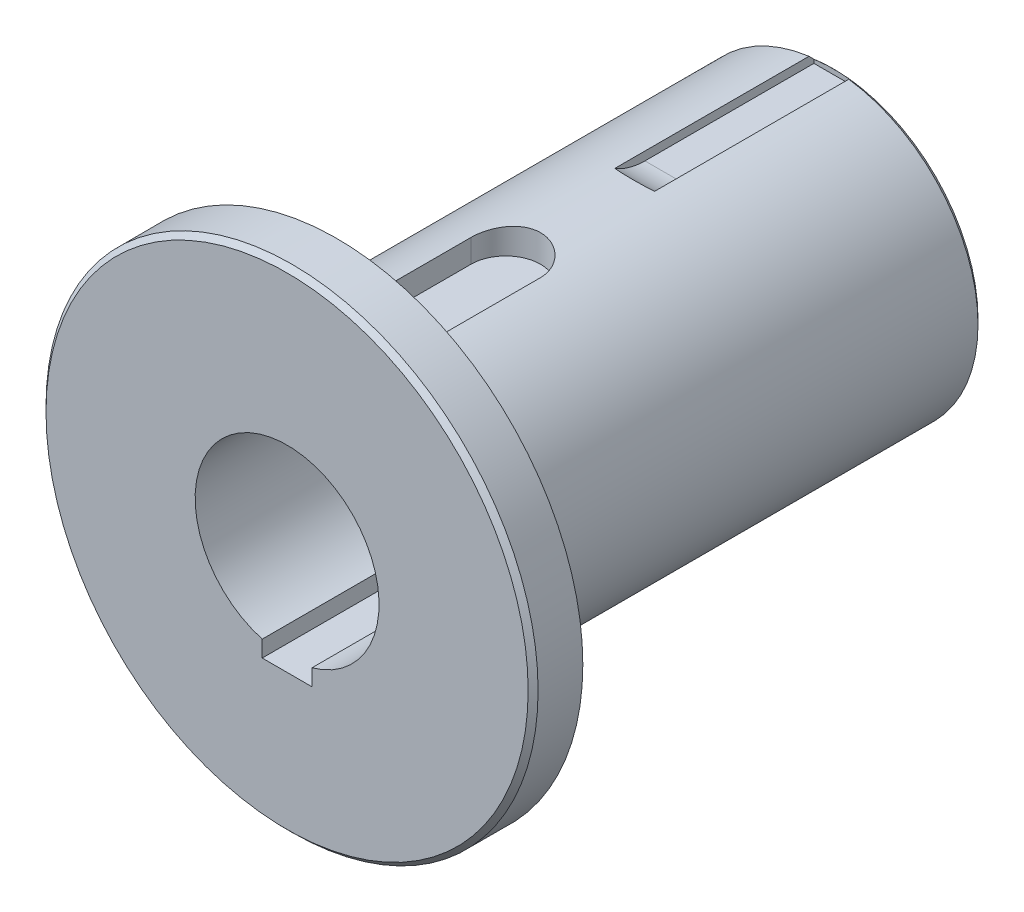
ISO-10303-21;
HEADER;
FILE_DESCRIPTION(('STEP AP214'),'2;1');
FILE_NAME('part.step','',(''),(''),'','','');
FILE_SCHEMA(('AUTOMOTIVE_DESIGN { 1 0 10303 214 1 1 1 1 }'));
ENDSEC;
DATA;
#1=APPLICATION_CONTEXT('core data for automotive mechanical design processes');
#2=APPLICATION_PROTOCOL_DEFINITION('international standard','automotive_design',2000,#1);
#3=PRODUCT_CONTEXT('',#1,'mechanical');
#4=PRODUCT('Part','Part','',(#3));
#5=PRODUCT_RELATED_PRODUCT_CATEGORY('part','',(#4));
#6=PRODUCT_DEFINITION_FORMATION('','',#4);
#7=PRODUCT_DEFINITION_CONTEXT('part definition',#1,'design');
#8=PRODUCT_DEFINITION('design','',#6,#7);
#9=PRODUCT_DEFINITION_SHAPE('','',#8);
#10=(LENGTH_UNIT() NAMED_UNIT(*) SI_UNIT(.MILLI.,.METRE.));
#11=(NAMED_UNIT(*) PLANE_ANGLE_UNIT() SI_UNIT($,.RADIAN.));
#12=(NAMED_UNIT(*) SI_UNIT($,.STERADIAN.) SOLID_ANGLE_UNIT());
#13=UNCERTAINTY_MEASURE_WITH_UNIT(LENGTH_MEASURE(1.E-05),#10,'distance_accuracy_value','');
#14=(GEOMETRIC_REPRESENTATION_CONTEXT(3) GLOBAL_UNCERTAINTY_ASSIGNED_CONTEXT((#13)) GLOBAL_UNIT_ASSIGNED_CONTEXT((#10,
#11,#12)) REPRESENTATION_CONTEXT('',''));
#15=CARTESIAN_POINT('',(0.,0.,0.));
#16=DIRECTION('',(0.,0.,1.));
#17=DIRECTION('',(1.,0.,0.));
#18=AXIS2_PLACEMENT_3D('',#15,#16,#17);
#19=CARTESIAN_POINT('',(0.,0.,106.615161212252));
#20=DIRECTION('',(0.,0.,1.));
#21=DIRECTION('',(1.,0.,0.));
#22=AXIS2_PLACEMENT_3D('',#19,#20,#21);
#23=CYLINDRICAL_SURFACE('',#22,30.);
#24=CARTESIAN_POINT('',(-7.,29.1719042916296,27.5661924866217));
#25=CARTESIAN_POINT('',(-7.00002411421393,29.1718836280542,27.760202781718));
#26=CARTESIAN_POINT('',(-6.99193535547208,29.1738390161234,27.9542059142503));
#27=CARTESIAN_POINT('',(-6.95970907835042,29.1815516316612,28.3407699676183));
#28=CARTESIAN_POINT('',(-6.93557400172962,29.1873082806932,28.5333311033742));
#29=CARTESIAN_POINT('',(-6.87149011126427,29.2024594943221,28.9152966488671));
#30=CARTESIAN_POINT('',(-6.83157004240951,29.2118474455254,29.1047061480874));
#31=CARTESIAN_POINT('',(-6.73624870466819,29.2339761389446,29.4793877419632));
#32=CARTESIAN_POINT('',(-6.68084727721047,29.2467169155023,29.6646597942191));
#33=CARTESIAN_POINT('',(-6.55501399536987,29.2751762218298,30.0297396873082));
#34=CARTESIAN_POINT('',(-6.48458566936267,29.2908940524784,30.2095487995587));
#35=CARTESIAN_POINT('',(-6.32919722447343,29.3248629412891,30.5626028315453));
#36=CARTESIAN_POINT('',(-6.24423172127334,29.3431149375883,30.7358452899601));
#37=CARTESIAN_POINT('',(-6.06042204547499,29.3816285329677,31.0745255833457));
#38=CARTESIAN_POINT('',(-5.96158043147475,29.4018897613663,31.2399648496407));
#39=CARTESIAN_POINT('',(-5.75065732655278,29.4438703807229,31.5620672279669));
#40=CARTESIAN_POINT('',(-5.63857088298884,29.4655903158167,31.7187270246018));
#41=CARTESIAN_POINT('',(-5.39995286915299,29.5102606512373,32.0247556591553));
#42=CARTESIAN_POINT('',(-5.27321042047966,29.5332255854316,32.1739579865721));
#43=CARTESIAN_POINT('',(-5.00765574159578,29.5794108890035,32.4612576682442));
#44=CARTESIAN_POINT('',(-4.86883932248192,29.6026313445705,32.5993511361874));
#45=CARTESIAN_POINT('',(-4.58009457635052,29.6486779083493,32.8634572638413));
#46=CARTESIAN_POINT('',(-4.43016634628761,29.6715040199997,32.9894700289386));
#47=CARTESIAN_POINT('',(-4.12018464974368,29.71613356433,33.2285587165297));
#48=CARTESIAN_POINT('',(-3.96013123768171,29.7379370025053,33.3416347085448));
#49=CARTESIAN_POINT('',(-3.62893413743855,29.7801786491074,33.5553621352573));
#50=CARTESIAN_POINT('',(-3.45767849606548,29.8005968310195,33.6558441561094));
#51=CARTESIAN_POINT('',(-3.10711414603736,29.8391843353717,33.8419561992283));
#52=CARTESIAN_POINT('',(-2.92780837352482,29.8573544688106,33.9275915820221));
#53=CARTESIAN_POINT('',(-2.56230161042519,29.8909400040852,34.0834071507189));
#54=CARTESIAN_POINT('',(-2.37609904865305,29.9063547734923,34.1535837892907));
#55=CARTESIAN_POINT('',(-1.9982534717445,29.9339747713742,34.2778628063068));
#56=CARTESIAN_POINT('',(-1.80661269941106,29.9461813022603,34.3319717087457));
#57=CARTESIAN_POINT('',(-1.42259871200211,29.9668573871981,34.4229022286328));
#58=CARTESIAN_POINT('',(-1.23029598169295,29.9753881431544,34.4600076775629));
#59=CARTESIAN_POINT('',(-0.843203665443142,29.9887728133821,34.5179758461181));
#60=CARTESIAN_POINT('',(-0.648415053918724,29.9936281259111,34.538844742737));
#61=CARTESIAN_POINT('',(-0.257697972924787,29.9995294771423,34.564186571426));
#62=CARTESIAN_POINT('',(-0.0617693973796738,30.0005751554845,34.5686579524261));
#63=CARTESIAN_POINT('',(0.329754655760121,29.9988263740418,34.56116192516));
#64=CARTESIAN_POINT('',(0.525350136908354,29.9960319554844,34.5491946933798));
#65=CARTESIAN_POINT('',(0.910947158088308,29.9867744509429,34.5093191268364));
#66=CARTESIAN_POINT('',(1.10098327534587,29.9803842054865,34.4817272319112));
#67=CARTESIAN_POINT('',(1.47807077410745,29.9641608358687,34.4110530922741));
#68=CARTESIAN_POINT('',(1.66512110257918,29.9543265239251,34.3679655033021));
#69=CARTESIAN_POINT('',(2.03480942471973,29.9314857700515,34.2666605467831));
#70=CARTESIAN_POINT('',(2.2174488883238,29.918480401377,34.2084482977955));
#71=CARTESIAN_POINT('',(2.57721097722183,29.8896397561874,34.0773102647429));
#72=CARTESIAN_POINT('',(2.75433151472669,29.8738034236324,34.0043789886968));
#73=CARTESIAN_POINT('',(3.10316353235071,29.8395933451229,33.8437345907248));
#74=CARTESIAN_POINT('',(3.27482231002064,29.8212008449444,33.7559110490513));
#75=CARTESIAN_POINT('',(3.61020567031688,29.7824600301887,33.5664858074996));
#76=CARTESIAN_POINT('',(3.77392749063086,29.7621110419388,33.4648793568025));
#77=CARTESIAN_POINT('',(4.09230862909155,29.7200066857018,33.2486251352563));
#78=CARTESIAN_POINT('',(4.2469685771027,29.6982514156829,33.1339782724415));
#79=CARTESIAN_POINT('',(4.54625547768361,29.6539112300472,32.8924055406394));
#80=CARTESIAN_POINT('',(4.69088225844295,29.6313263002331,32.7654794614687));
#81=CARTESIAN_POINT('',(4.97248641410616,29.585388546704,32.4970252859023));
#82=CARTESIAN_POINT('',(5.10920085468192,29.5620302181607,32.3552221734742));
#83=CARTESIAN_POINT('',(5.37018467856494,29.5157361482684,32.0606146819838));
#84=CARTESIAN_POINT('',(5.4944581984801,29.492800268539,31.9078139888614));
#85=CARTESIAN_POINT('',(5.72983503841243,29.4479771386151,31.5920820448671));
#86=CARTESIAN_POINT('',(5.8409298084855,29.4260905746088,31.4291443207729));
#87=CARTESIAN_POINT('',(6.04902544410606,29.3840187952295,31.0943815723485));
#88=CARTESIAN_POINT('',(6.14603170983798,29.3638329292241,30.922559987667));
#89=CARTESIAN_POINT('',(6.32570726128601,29.3256527328194,30.5703067199483));
#90=CARTESIAN_POINT('',(6.40830670476409,29.3076691978243,30.3898382203243));
#91=CARTESIAN_POINT('',(6.55793107464896,29.2745523190384,30.0223836685258));
#92=CARTESIAN_POINT('',(6.62496216952574,29.2594178468475,29.8354002315782));
#93=CARTESIAN_POINT('',(6.74288443273005,29.2324677203955,29.4563930238738));
#94=CARTESIAN_POINT('',(6.7937923183648,29.2206486300529,29.2643746987592));
#95=CARTESIAN_POINT('',(6.87911464953864,29.2006797959219,28.8766004861277));
#96=CARTESIAN_POINT('',(6.91353686181728,29.1925283243527,28.680846403893));
#97=CARTESIAN_POINT('',(6.95970051013831,29.1815525267545,28.3317832668231));
#98=CARTESIAN_POINT('',(6.97481829021193,29.1779386184606,28.178936426278));
#99=CARTESIAN_POINT('',(6.99496346010428,29.1731127699093,27.8727949605115));
#100=CARTESIAN_POINT('',(7.00000743999352,29.1718968805081,27.7195014885619));
#101=CARTESIAN_POINT('',(7.,29.1719042916296,27.5661924866217));
#102=B_SPLINE_CURVE_WITH_KNOTS('',3,(#24,#25,#26,#27,#28,#29,#30,#31,#32,#33,#34,#35,#36,#37,
#38,#39,#40,#41,#42,#43,#44,#45,#46,#47,#48,#49,#50,#51,#52,#53,#54,#55,#56,#57,#58,#59,#60,#61,
#62,#63,#64,#65,#66,#67,#68,#69,#70,#71,#72,#73,#74,#75,#76,#77,#78,#79,#80,#81,#82,#83,#84,#85,
#86,#87,#88,#89,#90,#91,#92,#93,#94,#95,#96,#97,#98,#99,#100,#101),.UNSPECIFIED.,.F.,.F.,(4,2,2,
2,2,2,2,2,2,2,2,2,2,2,2,2,2,2,2,2,2,2,2,2,2,2,2,2,2,2,2,2,2,2,2,2,2,2,4),(0.,0.581841613817431,
1.16359470938759,1.74429325660939,2.32499775197942,2.90556604537755,3.4863498385422,
4.06702668205124,4.64792134941402,5.23856610326474,5.82941659711472,6.42026193618351,
7.01110409994986,7.60919358830019,8.20706667869259,8.80507682094583,9.40284381965939,
9.99023238092405,10.577397368117,11.1646178948504,11.7518321171932,12.3275585227948,
12.903483679542,13.4792141822582,14.0551599007113,14.6355793619066,15.2161993981719,
15.7967790292309,16.3773685998245,16.9717344696553,17.5659020517373,18.1604530263188,
18.754775502054,19.3519035908746,19.94879468125,20.5450648450626,21.1410538167334,
21.6016221752841,22.0614314178326),.UNSPECIFIED.);
#103=CARTESIAN_POINT('',(-7.,29.1719042916296,27.5661924866217));
#104=VERTEX_POINT('',#103);
#105=CARTESIAN_POINT('',(7.,29.1719042916296,27.5661924866217));
#106=VERTEX_POINT('',#105);
#107=EDGE_CURVE('E279',#104,#106,#102,.T.);
#108=ORIENTED_EDGE('',*,*,#107,.F.);
#109=DIRECTION('',(0.,0.,1.));
#110=VECTOR('',#109,1.);
#111=CARTESIAN_POINT('',(-7.00000000000001,29.1719042916296,106.615161212252));
#112=LINE('',#111,#110);
#113=CARTESIAN_POINT('',(-7.,29.1719042916296,5.56619248662167));
#114=VERTEX_POINT('',#113);
#115=EDGE_CURVE('E319',#114,#104,#112,.T.);
#116=ORIENTED_EDGE('',*,*,#115,.F.);
#117=CARTESIAN_POINT('',(7.,29.1719042916296,5.56619248662167));
#118=CARTESIAN_POINT('',(7.00002411421393,29.1718836280542,5.3721821915253));
#119=CARTESIAN_POINT('',(6.99193535547208,29.1738390161234,5.17817905899305));
#120=CARTESIAN_POINT('',(6.95970907835041,29.1815516316612,4.79161500562505));
#121=CARTESIAN_POINT('',(6.93557400172961,29.1873082806932,4.59905386986918));
#122=CARTESIAN_POINT('',(6.87149011126426,29.2024594943221,4.21708832437629));
#123=CARTESIAN_POINT('',(6.83157004240951,29.2118474455254,4.02767882515596));
#124=CARTESIAN_POINT('',(6.73624870466819,29.2339761389446,3.6529972312801));
#125=CARTESIAN_POINT('',(6.68084727721047,29.2467169155023,3.46772517902424));
#126=CARTESIAN_POINT('',(6.55501399536987,29.2751762218298,3.10264528593514));
#127=CARTESIAN_POINT('',(6.48458566936266,29.2908940524784,2.9228361736846));
#128=CARTESIAN_POINT('',(6.32919722447343,29.3248629412891,2.56978214169808));
#129=CARTESIAN_POINT('',(6.24423172127334,29.3431149375883,2.39653968328327));
#130=CARTESIAN_POINT('',(6.06042204547499,29.3816285329677,2.0578593898976));
#131=CARTESIAN_POINT('',(5.96158043147475,29.4018897613663,1.89242012360259));
#132=CARTESIAN_POINT('',(5.75065732655277,29.4438703807229,1.57031774527644));
#133=CARTESIAN_POINT('',(5.63857088298883,29.4655903158167,1.41365794864154));
#134=CARTESIAN_POINT('',(5.39995286915299,29.5102606512373,1.10762931408803));
#135=CARTESIAN_POINT('',(5.27321042047965,29.5332255854317,0.958426986671257));
#136=CARTESIAN_POINT('',(5.00765574159577,29.5794108890034,0.67112730499915));
#137=CARTESIAN_POINT('',(4.86883932248192,29.6026313445705,0.533033837055917));
#138=CARTESIAN_POINT('',(4.58009457635052,29.6486779083493,0.268927709402013));
#139=CARTESIAN_POINT('',(4.43016634628761,29.6715040199997,0.142914944304763));
#140=CARTESIAN_POINT('',(4.12018464974368,29.71613356433,-0.0961737432863971));
#141=CARTESIAN_POINT('',(3.96013123768171,29.7379370025053,-0.20924973530144));
#142=CARTESIAN_POINT('',(3.62893413743855,29.7801786491074,-0.422977162013976));
#143=CARTESIAN_POINT('',(3.45767849606548,29.8005968310195,-0.523459182866036));
#144=CARTESIAN_POINT('',(3.10711414603736,29.8391843353717,-0.709571225984935));
#145=CARTESIAN_POINT('',(2.92780837352481,29.8573544688106,-0.795206608778714));
#146=CARTESIAN_POINT('',(2.56230161042519,29.8909400040852,-0.951022177475517));
#147=CARTESIAN_POINT('',(2.37609904865305,29.9063547734923,-1.02119881604733));
#148=CARTESIAN_POINT('',(1.9982534717445,29.9339747713742,-1.14547783306348));
#149=CARTESIAN_POINT('',(1.80661269941106,29.9461813022603,-1.19958673550236));
#150=CARTESIAN_POINT('',(1.42259871200211,29.9668573871981,-1.29051725538944));
#151=CARTESIAN_POINT('',(1.23029598169295,29.9753881431544,-1.32762270431955));
#152=CARTESIAN_POINT('',(0.84320366544314,29.9887728133821,-1.38559087287472));
#153=CARTESIAN_POINT('',(0.648415053918722,29.9936281259111,-1.40645976949365));
#154=CARTESIAN_POINT('',(0.257697972924785,29.9995294771423,-1.43180159818266));
#155=CARTESIAN_POINT('',(0.0617693973796715,30.0005751554845,-1.43627297918279));
#156=CARTESIAN_POINT('',(-0.329754655760123,29.9988263740418,-1.42877695191663));
#157=CARTESIAN_POINT('',(-0.525350136908355,29.9960319554844,-1.41680972013641));
#158=CARTESIAN_POINT('',(-0.910947158088309,29.9867744509429,-1.37693415359307));
#159=CARTESIAN_POINT('',(-1.10098327534587,29.9803842054865,-1.34934225866788));
#160=CARTESIAN_POINT('',(-1.47807077410745,29.9641608358687,-1.27866811903073));
#161=CARTESIAN_POINT('',(-1.66512110257918,29.9543265239251,-1.23558053005874));
#162=CARTESIAN_POINT('',(-2.03480942471973,29.9314857700515,-1.13427557353976));
#163=CARTESIAN_POINT('',(-2.2174488883238,29.918480401377,-1.07606332455216));
#164=CARTESIAN_POINT('',(-2.57721097722183,29.8896397561874,-0.944925291499586));
#165=CARTESIAN_POINT('',(-2.7543315147267,29.8738034236324,-0.871994015453435));
#166=CARTESIAN_POINT('',(-3.10316353235071,29.8395933451229,-0.711349617481434));
#167=CARTESIAN_POINT('',(-3.27482231002064,29.8212008449444,-0.623526075807914));
#168=CARTESIAN_POINT('',(-3.61020567031688,29.7824600301887,-0.434100834256252));
#169=CARTESIAN_POINT('',(-3.77392749063087,29.7621110419388,-0.332494383559166));
#170=CARTESIAN_POINT('',(-4.09230862909155,29.7200066857018,-0.116240162012977));
#171=CARTESIAN_POINT('',(-4.2469685771027,29.6982514156829,-0.00159329919820751));
#172=CARTESIAN_POINT('',(-4.54625547768361,29.6539112300472,0.239979432603983));
#173=CARTESIAN_POINT('',(-4.69088225844296,29.6313263002331,0.366905511774626));
#174=CARTESIAN_POINT('',(-4.97248641410617,29.585388546704,0.635359687341003));
#175=CARTESIAN_POINT('',(-5.10920085468193,29.5620302181607,0.777162799769154));
#176=CARTESIAN_POINT('',(-5.37018467856494,29.5157361482684,1.07177029125956));
#177=CARTESIAN_POINT('',(-5.4944581984801,29.492800268539,1.22457098438198));
#178=CARTESIAN_POINT('',(-5.72983503841243,29.4479771386151,1.54030292837628));
#179=CARTESIAN_POINT('',(-5.8409298084855,29.4260905746088,1.70324065247045));
#180=CARTESIAN_POINT('',(-6.04902544410607,29.3840187952295,2.03800340089487));
#181=CARTESIAN_POINT('',(-6.14603170983798,29.3638329292241,2.2098249855763));
#182=CARTESIAN_POINT('',(-6.32570726128601,29.3256527328194,2.56207825329502));
#183=CARTESIAN_POINT('',(-6.40830670476409,29.3076691978243,2.74254675291907));
#184=CARTESIAN_POINT('',(-6.55793107464896,29.2745523190384,3.11000130471754));
#185=CARTESIAN_POINT('',(-6.62496216952574,29.2594178468475,3.29698474166511));
#186=CARTESIAN_POINT('',(-6.74288443273006,29.2324677203955,3.67599194936951));
#187=CARTESIAN_POINT('',(-6.7937923183648,29.2206486300529,3.8680102744841));
#188=CARTESIAN_POINT('',(-6.87911464953865,29.2006797959219,4.25578448711565));
#189=CARTESIAN_POINT('',(-6.91353686181728,29.1925283243527,4.45153856935032));
#190=CARTESIAN_POINT('',(-6.95970051013832,29.1815525267545,4.80060170642028));
#191=CARTESIAN_POINT('',(-6.97481829021194,29.1779386184606,4.95344854696539));
#192=CARTESIAN_POINT('',(-6.99496346010428,29.1731127699093,5.25959001273183));
#193=CARTESIAN_POINT('',(-7.00000743999352,29.1718968805081,5.41288348468141));
#194=CARTESIAN_POINT('',(-7.,29.1719042916296,5.56619248662167));
#195=B_SPLINE_CURVE_WITH_KNOTS('',3,(#117,#118,#119,#120,#121,#122,#123,#124,#125,#126,#127,
#128,#129,#130,#131,#132,#133,#134,#135,#136,#137,#138,#139,#140,#141,#142,#143,#144,#145,#146,
#147,#148,#149,#150,#151,#152,#153,#154,#155,#156,#157,#158,#159,#160,#161,#162,#163,#164,#165,
#166,#167,#168,#169,#170,#171,#172,#173,#174,#175,#176,#177,#178,#179,#180,#181,#182,#183,#184,
#185,#186,#187,#188,#189,#190,#191,#192,#193,#194),.UNSPECIFIED.,.F.,.F.,(4,2,2,2,2,2,2,2,2,2,2,
2,2,2,2,2,2,2,2,2,2,2,2,2,2,2,2,2,2,2,2,2,2,2,2,2,2,2,4),(0.,0.581841613817431,1.16359470938759,
1.74429325660939,2.32499775197942,2.90556604537755,3.4863498385422,4.06702668205125,
4.64792134941403,5.23856610326475,5.82941659711472,6.42026193618351,7.01110409994986,
7.60919358830019,8.20706667869258,8.80507682094583,9.40284381965939,9.99023238092405,
10.577397368117,11.1646178948504,11.7518321171932,12.3275585227948,12.903483679542,
13.4792141822582,14.0551599007113,14.6355793619066,15.2161993981719,15.7967790292309,
16.3773685998245,16.9717344696553,17.5659020517373,18.1604530263188,18.754775502054,
19.3519035908746,19.94879468125,20.5450648450626,21.1410538167334,21.6016221752841,
22.0614314178326),.UNSPECIFIED.);
#196=CARTESIAN_POINT('',(7.,29.1719042916296,5.56619248662167));
#197=VERTEX_POINT('',#196);
#198=EDGE_CURVE('E312',#197,#114,#195,.T.);
#199=ORIENTED_EDGE('',*,*,#198,.F.);
#200=DIRECTION('',(0.,0.,1.));
#201=VECTOR('',#200,1.);
#202=CARTESIAN_POINT('',(6.99999999999998,29.1719042916296,106.615161212252));
#203=LINE('',#202,#201);
#204=EDGE_CURVE('E287',#106,#197,#203,.F.);
#205=ORIENTED_EDGE('',*,*,#204,.F.);
#206=EDGE_LOOP('',(#108,#116,#199,#205));
#207=FACE_BOUND('',#206,.T.);
#208=CARTESIAN_POINT('',(0.,0.,39.5661924866217));
#209=DIRECTION('',(0.,0.,1.));
#210=DIRECTION('',(1.,0.,0.));
#211=AXIS2_PLACEMENT_3D('',#208,#209,#210);
#212=CIRCLE('',#211,30.);
#213=CARTESIAN_POINT('',(30.,0.,39.5661924866217));
#214=VERTEX_POINT('',#213);
#215=EDGE_CURVE('E271',#214,#214,#212,.T.);
#216=ORIENTED_EDGE('',*,*,#215,.F.);
#217=EDGE_LOOP('',(#216));
#218=FACE_BOUND('',#217,.T.);
#219=DIRECTION('',(0.,0.,1.));
#220=VECTOR('',#219,1.);
#221=CARTESIAN_POINT('',(-4.,29.732137494637,106.615161212252));
#222=LINE('',#221,#220);
#223=CARTESIAN_POINT('',(-4.,29.732137494637,-59.4338075133784));
#224=VERTEX_POINT('',#223);
#225=CARTESIAN_POINT('',(-4.,29.732137494637,-20.3643048915547));
#226=VERTEX_POINT('',#225);
#227=EDGE_CURVE('E163',#224,#226,#222,.T.);
#228=ORIENTED_EDGE('',*,*,#227,.F.);
#229=CARTESIAN_POINT('',(0.,0.,-59.4338075133784));
#230=DIRECTION('',(0.,0.,1.));
#231=DIRECTION('',(1.,0.,0.));
#232=AXIS2_PLACEMENT_3D('',#229,#230,#231);
#233=CIRCLE('',#232,30.);
#234=CARTESIAN_POINT('',(4.,29.732137494637,-59.4338075133784));
#235=VERTEX_POINT('',#234);
#236=EDGE_CURVE('E330',#224,#235,#233,.T.);
#237=ORIENTED_EDGE('',*,*,#236,.T.);
#238=DIRECTION('',(0.,0.,1.));
#239=VECTOR('',#238,1.);
#240=CARTESIAN_POINT('',(4.,29.732137494637,106.615161212252));
#241=LINE('',#240,#239);
#242=CARTESIAN_POINT('',(4.,29.732137494637,-20.3643048915547));
#243=VERTEX_POINT('',#242);
#244=EDGE_CURVE('E74',#235,#243,#241,.T.);
#245=ORIENTED_EDGE('',*,*,#244,.T.);
#246=CARTESIAN_POINT('',(4.,29.732137494637,-20.3643048915547));
#247=CARTESIAN_POINT('',(3.76006765389458,29.7644257733083,-20.3123833502543));
#248=CARTESIAN_POINT('',(3.51864111985126,29.793940295135,-20.2657680172054));
#249=CARTESIAN_POINT('',(3.03345626392283,29.8472369226205,-20.1826690782229));
#250=CARTESIAN_POINT('',(2.78969828748671,29.8710198642536,-20.1461839946331));
#251=CARTESIAN_POINT('',(2.30035848524842,29.9126846218195,-20.0828398645312));
#252=CARTESIAN_POINT('',(2.05477610096309,29.9305645476231,-20.0559839010003));
#253=CARTESIAN_POINT('',(1.56241715994597,29.9603021426745,-20.0115911196951));
#254=CARTESIAN_POINT('',(1.3156405648856,29.9721596173183,-19.9940546030602));
#255=CARTESIAN_POINT('',(0.58488246291259,29.9981980716383,-19.9556230942951));
#256=CARTESIAN_POINT('',(0.0998416917241349,30.0037485577762,-19.9475665856554));
#257=CARTESIAN_POINT('',(-0.869066159218806,29.9913203547964,-19.9657983913067));
#258=CARTESIAN_POINT('',(-1.35293372769346,29.9733542387685,-19.9920683530272));
#259=CARTESIAN_POINT('',(-2.01604664431148,29.932737645813,-20.0527553739791));
#260=CARTESIAN_POINT('',(-2.19741260793669,29.9199656208812,-20.0719204034011));
#261=CARTESIAN_POINT('',(-2.55922237267075,29.8911907270442,-20.1154627922077));
#262=CARTESIAN_POINT('',(-2.73966641039998,29.8751887347695,-20.1398387374275));
#263=CARTESIAN_POINT('',(-3.10090955446137,29.839865267482,-20.1941870967573));
#264=CARTESIAN_POINT('',(-3.28169945911707,29.8205176719621,-20.2242037233043));
#265=CARTESIAN_POINT('',(-3.64193832186892,29.778670576805,-20.2899298765112));
#266=CARTESIAN_POINT('',(-3.8213867951797,29.7561699906926,-20.3256413661268));
#267=CARTESIAN_POINT('',(-4.,29.732137494637,-20.3643048915547));
#268=B_SPLINE_CURVE_WITH_KNOTS('',3,(#246,#247,#248,#249,#250,#251,#252,#253,#254,#255,#256,
#257,#258,#259,#260,#261,#262,#263,#264,#265,#266,#267),.UNSPECIFIED.,.F.,.F.,(4,2,2,2,2,2,2,2,
2,2,4),(0.,0.742684392427886,1.48526039568667,2.22807393964252,2.97091148468149,4.4244414793512,
5.87719466534896,6.4255845543172,6.97382580696183,7.52655846355251,8.07948205435813),.UNSPECIFIED.);
#269=EDGE_CURVE('E11',#243,#226,#268,.T.);
#270=ORIENTED_EDGE('',*,*,#269,.T.);
#271=EDGE_LOOP('',(#228,#237,#245,#270));
#272=FACE_BOUND('',#271,.T.);
#273=ADVANCED_FACE('F50',(#207,#218,#272),#23,.T.);
#274=CARTESIAN_POINT('',(0.,0.,-59.4338075133784));
#275=DIRECTION('',(0.,0.,1.));
#276=DIRECTION('',(1.,0.,0.));
#277=AXIS2_PLACEMENT_3D('',#274,#275,#276);
#278=CONICAL_SURFACE('',#277,30.,0.785398163397464);
#279=CARTESIAN_POINT('',(0.,0.,-60.4338075133783));
#280=DIRECTION('',(0.,0.,1.));
#281=DIRECTION('',(1.,0.,0.));
#282=AXIS2_PLACEMENT_3D('',#279,#280,#281);
#283=CIRCLE('',#282,29.);
#284=CARTESIAN_POINT('',(29.,0.,-60.4338075133783));
#285=VERTEX_POINT('',#284);
#286=EDGE_CURVE('E334',#285,#285,#283,.F.);
#287=ORIENTED_EDGE('',*,*,#286,.F.);
#288=EDGE_LOOP('',(#287));
#289=FACE_BOUND('',#288,.T.);
#290=ORIENTED_EDGE('',*,*,#236,.F.);
#291=CARTESIAN_POINT('',(-4.,31.982080300973,-57.2025577644486));
#292=CARTESIAN_POINT('',(-4.,31.5239028122366,-57.6571919439404));
#293=CARTESIAN_POINT('',(-4.,31.0656513599752,-58.1117516005638));
#294=CARTESIAN_POINT('',(-4.,30.1489767847966,-59.0206976055475));
#295=CARTESIAN_POINT('',(-4.,29.6905536619123,-59.4750839539409));
#296=CARTESIAN_POINT('',(-4.,28.773511804866,-60.3836592754345));
#297=CARTESIAN_POINT('',(-4.,28.3148930706944,-60.8378482485252));
#298=CARTESIAN_POINT('',(-4.,27.3974283811247,-61.7459968125416));
#299=CARTESIAN_POINT('',(-4.,26.9385824256832,-62.1999564034234));
#300=CARTESIAN_POINT('',(-4.,26.4796071311577,-62.6537852239839));
#301=B_SPLINE_CURVE_WITH_KNOTS('',3,(#291,#292,#293,#294,#295,#296,#297,#298,#299,#300),
.UNSPECIFIED.,.F.,.F.,(4,2,2,2,4),(0.,1.93638055878278,3.87276074813663,5.80914103128443,
7.74552168442344),.UNSPECIFIED.);
#302=CARTESIAN_POINT('',(-4.,28.7417575618249,-60.4150441396107));
#303=VERTEX_POINT('',#302);
#304=EDGE_CURVE('E67',#224,#303,#301,.T.);
#305=ORIENTED_EDGE('',*,*,#304,.T.);
#306=CARTESIAN_POINT('',(0.,0.290171214114536,-60.7023892078635));
#307=DIRECTION('',(0.,0.01009892423763,-0.999949004564354));
#308=DIRECTION('',(0.,0.999949004564354,0.01009892423763));
#309=AXIS2_PLACEMENT_3D('',#306,#307,#308);
#310=ELLIPSE('',#309,28.7328835514289,28.7299529848723);
#311=CARTESIAN_POINT('',(4.,28.7417575618249,-60.4150441396107));
#312=VERTEX_POINT('',#311);
#313=EDGE_CURVE('E346',#312,#303,#310,.F.);
#314=ORIENTED_EDGE('',*,*,#313,.F.);
#315=CARTESIAN_POINT('',(4.,31.982080300973,-57.2025577644486));
#316=CARTESIAN_POINT('',(4.,31.5239028122366,-57.6571919439405));
#317=CARTESIAN_POINT('',(4.,31.0656513599752,-58.1117516005638));
#318=CARTESIAN_POINT('',(4.,30.1489767847966,-59.0206976055475));
#319=CARTESIAN_POINT('',(4.,29.6905536619123,-59.4750839539409));
#320=CARTESIAN_POINT('',(4.,28.773511804866,-60.3836592754345));
#321=CARTESIAN_POINT('',(4.,28.3148930706944,-60.8378482485252));
#322=CARTESIAN_POINT('',(4.,27.3974283811247,-61.7459968125416));
#323=CARTESIAN_POINT('',(4.,26.9385824256832,-62.1999564034234));
#324=CARTESIAN_POINT('',(4.,26.4796071311577,-62.6537852239839));
#325=B_SPLINE_CURVE_WITH_KNOTS('',3,(#315,#316,#317,#318,#319,#320,#321,#322,#323,#324),
.UNSPECIFIED.,.F.,.F.,(4,2,2,2,4),(0.,1.93638055878279,3.87276074813663,5.80914103128443,
7.74552168442343),.UNSPECIFIED.);
#326=EDGE_CURVE('E338',#235,#312,#325,.T.);
#327=ORIENTED_EDGE('',*,*,#326,.F.);
#328=EDGE_LOOP('',(#290,#305,#314,#327));
#329=FACE_BOUND('',#328,.T.);
#330=ADVANCED_FACE('F53',(#289,#329),#278,.T.);
#331=CARTESIAN_POINT('',(0.,18.5,49.5661924866217));
#332=DIRECTION('',(0.,0.,-1.));
#333=DIRECTION('',(-1.,0.,0.));
#334=AXIS2_PLACEMENT_3D('',#331,#332,#333);
#335=PLANE('',#334);
#336=CARTESIAN_POINT('',(0.,0.,49.5661924866217));
#337=DIRECTION('',(0.,0.,-1.));
#338=DIRECTION('',(-1.,0.,0.));
#339=AXIS2_PLACEMENT_3D('',#336,#337,#338);
#340=CIRCLE('',#339,48.5);
#341=CARTESIAN_POINT('',(-48.5,0.,49.5661924866217));
#342=VERTEX_POINT('',#341);
#343=EDGE_CURVE('E322',#342,#342,#340,.F.);
#344=ORIENTED_EDGE('',*,*,#343,.T.);
#345=EDGE_LOOP('',(#344));
#346=FACE_BOUND('',#345,.T.);
#347=CARTESIAN_POINT('',(0.,0.,49.5661924866217));
#348=DIRECTION('',(0.,0.,1.));
#349=DIRECTION('',(1.,0.,0.));
#350=AXIS2_PLACEMENT_3D('',#347,#348,#349);
#351=CIRCLE('',#350,18.5);
#352=CARTESIAN_POINT('',(5.,-17.8115131305569,49.5661924866217));
#353=VERTEX_POINT('',#352);
#354=CARTESIAN_POINT('',(-5.,-17.8115131305569,49.5661924866217));
#355=VERTEX_POINT('',#354);
#356=EDGE_CURVE('E254',#353,#355,#351,.T.);
#357=ORIENTED_EDGE('',*,*,#356,.F.);
#358=DIRECTION('',(0.,-1.,0.));
#359=VECTOR('',#358,1.);
#360=CARTESIAN_POINT('',(5.,0.,49.5661924866217));
#361=LINE('',#360,#359);
#362=CARTESIAN_POINT('',(5.,-21.1115131305569,49.5661924866217));
#363=VERTEX_POINT('',#362);
#364=EDGE_CURVE('E236',#353,#363,#361,.T.);
#365=ORIENTED_EDGE('',*,*,#364,.T.);
#366=DIRECTION('',(-1.,0.,0.));
#367=VECTOR('',#366,1.);
#368=CARTESIAN_POINT('',(0.,-21.1115131305569,49.5661924866217));
#369=LINE('',#368,#367);
#370=CARTESIAN_POINT('',(-5.,-21.1115131305569,49.5661924866217));
#371=VERTEX_POINT('',#370);
#372=EDGE_CURVE('E228',#363,#371,#369,.T.);
#373=ORIENTED_EDGE('',*,*,#372,.T.);
#374=DIRECTION('',(0.,-1.,0.));
#375=VECTOR('',#374,1.);
#376=CARTESIAN_POINT('',(-5.,0.,49.5661924866217));
#377=LINE('',#376,#375);
#378=EDGE_CURVE('E232',#355,#371,#377,.T.);
#379=ORIENTED_EDGE('',*,*,#378,.F.);
#380=EDGE_LOOP('',(#357,#365,#373,#379));
#381=FACE_BOUND('',#380,.T.);
#382=ADVANCED_FACE('F377',(#346,#381),#335,.F.);
#383=CARTESIAN_POINT('',(0.,0.,106.615161212252));
#384=DIRECTION('',(0.,0.,1.));
#385=DIRECTION('',(1.,0.,0.));
#386=AXIS2_PLACEMENT_3D('',#383,#384,#385);
#387=CYLINDRICAL_SURFACE('',#386,49.5);
#388=CARTESIAN_POINT('',(0.,0.,48.5661924866216));
#389=DIRECTION('',(0.,0.,-1.));
#390=DIRECTION('',(-1.,0.,0.));
#391=AXIS2_PLACEMENT_3D('',#388,#389,#390);
#392=CIRCLE('',#391,49.5);
#393=CARTESIAN_POINT('',(-49.5,0.,48.5661924866216));
#394=VERTEX_POINT('',#393);
#395=EDGE_CURVE('E326',#394,#394,#392,.T.);
#396=ORIENTED_EDGE('',*,*,#395,.T.);
#397=EDGE_LOOP('',(#396));
#398=FACE_BOUND('',#397,.T.);
#399=CARTESIAN_POINT('',(0.,0.,39.5661924866217));
#400=DIRECTION('',(0.,0.,1.));
#401=DIRECTION('',(1.,0.,0.));
#402=AXIS2_PLACEMENT_3D('',#399,#400,#401);
#403=CIRCLE('',#402,49.5);
#404=CARTESIAN_POINT('',(49.5,0.,39.5661924866217));
#405=VERTEX_POINT('',#404);
#406=EDGE_CURVE('E275',#405,#405,#403,.T.);
#407=ORIENTED_EDGE('',*,*,#406,.T.);
#408=EDGE_LOOP('',(#407));
#409=FACE_BOUND('',#408,.T.);
#410=ADVANCED_FACE('F406',(#398,#409),#387,.T.);
#411=CARTESIAN_POINT('',(0.,49.5,39.5661924866217));
#412=DIRECTION('',(0.,0.,1.));
#413=DIRECTION('',(1.,0.,0.));
#414=AXIS2_PLACEMENT_3D('',#411,#412,#413);
#415=PLANE('',#414);
#416=ORIENTED_EDGE('',*,*,#406,.F.);
#417=EDGE_LOOP('',(#416));
#418=FACE_BOUND('',#417,.T.);
#419=ORIENTED_EDGE('',*,*,#215,.T.);
#420=EDGE_LOOP('',(#419));
#421=FACE_BOUND('',#420,.T.);
#422=ADVANCED_FACE('F403',(#418,#421),#415,.F.);
#423=CARTESIAN_POINT('',(0.,30.,-60.4338075133783));
#424=DIRECTION('',(0.,0.,1.));
#425=DIRECTION('',(1.,0.,0.));
#426=AXIS2_PLACEMENT_3D('',#423,#424,#425);
#427=PLANE('',#426);
#428=ORIENTED_EDGE('',*,*,#286,.T.);
#429=EDGE_LOOP('',(#428));
#430=FACE_BOUND('',#429,.T.);
#431=DIRECTION('',(-1.,0.,0.));
#432=VECTOR('',#431,1.);
#433=CARTESIAN_POINT('',(0.,-21.1115131305569,-60.4338075133783));
#434=LINE('',#433,#432);
#435=CARTESIAN_POINT('',(5.,-21.1115131305569,-60.4338075133783));
#436=VERTEX_POINT('',#435);
#437=CARTESIAN_POINT('',(-5.,-21.1115131305569,-60.4338075133783));
#438=VERTEX_POINT('',#437);
#439=EDGE_CURVE('E227',#436,#438,#434,.T.);
#440=ORIENTED_EDGE('',*,*,#439,.F.);
#441=DIRECTION('',(0.,-1.,0.));
#442=VECTOR('',#441,1.);
#443=CARTESIAN_POINT('',(5.,0.,-60.4338075133783));
#444=LINE('',#443,#442);
#445=CARTESIAN_POINT('',(5.,-17.8115131305569,-60.4338075133783));
#446=VERTEX_POINT('',#445);
#447=EDGE_CURVE('E233',#446,#436,#444,.T.);
#448=ORIENTED_EDGE('',*,*,#447,.F.);
#449=CARTESIAN_POINT('',(0.,0.,-60.4338075133783));
#450=DIRECTION('',(0.,0.,1.));
#451=DIRECTION('',(1.,0.,0.));
#452=AXIS2_PLACEMENT_3D('',#449,#450,#451);
#453=CIRCLE('',#452,18.5);
#454=CARTESIAN_POINT('',(-5.00000000000001,-17.8115131305569,-60.4338075133783));
#455=VERTEX_POINT('',#454);
#456=EDGE_CURVE('E267',#446,#455,#453,.T.);
#457=ORIENTED_EDGE('',*,*,#456,.T.);
#458=DIRECTION('',(0.,-1.,0.));
#459=VECTOR('',#458,1.);
#460=CARTESIAN_POINT('',(-5.,0.,-60.4338075133783));
#461=LINE('',#460,#459);
#462=EDGE_CURVE('E244',#455,#438,#461,.T.);
#463=ORIENTED_EDGE('',*,*,#462,.T.);
#464=EDGE_LOOP('',(#440,#448,#457,#463));
#465=FACE_BOUND('',#464,.T.);
#466=ADVANCED_FACE('F405',(#430,#465),#427,.F.);
#467=CARTESIAN_POINT('',(0.,0.,106.615161212252));
#468=DIRECTION('',(0.,0.,1.));
#469=DIRECTION('',(1.,0.,0.));
#470=AXIS2_PLACEMENT_3D('',#467,#468,#469);
#471=CYLINDRICAL_SURFACE('',#470,18.5);
#472=ORIENTED_EDGE('',*,*,#456,.F.);
#473=DIRECTION('',(0.,0.,-1.));
#474=VECTOR('',#473,1.);
#475=CARTESIAN_POINT('',(5.,-17.8115131305569,49.5661924866217));
#476=LINE('',#475,#474);
#477=EDGE_CURVE('E255',#353,#446,#476,.T.);
#478=ORIENTED_EDGE('',*,*,#477,.F.);
#479=ORIENTED_EDGE('',*,*,#356,.T.);
#480=DIRECTION('',(0.,0.,-1.));
#481=VECTOR('',#480,1.);
#482=CARTESIAN_POINT('',(-5.,-17.8115131305569,49.5661924866217));
#483=LINE('',#482,#481);
#484=EDGE_CURVE('E258',#355,#455,#483,.T.);
#485=ORIENTED_EDGE('',*,*,#484,.T.);
#486=EDGE_LOOP('',(#472,#478,#479,#485));
#487=FACE_BOUND('',#486,.T.);
#488=ADVANCED_FACE('F412',(#487),#471,.F.);
#489=CARTESIAN_POINT('',(0.,-21.1115131305569,49.5661924866217));
#490=DIRECTION('',(0.,-1.,0.));
#491=DIRECTION('',(0.,0.,-1.));
#492=AXIS2_PLACEMENT_3D('',#489,#490,#491);
#493=PLANE('',#492);
#494=ORIENTED_EDGE('',*,*,#439,.T.);
#495=DIRECTION('',(0.,0.,-1.));
#496=VECTOR('',#495,1.);
#497=CARTESIAN_POINT('',(-5.,-21.1115131305569,49.5661924866217));
#498=LINE('',#497,#496);
#499=EDGE_CURVE('E240',#371,#438,#498,.T.);
#500=ORIENTED_EDGE('',*,*,#499,.F.);
#501=ORIENTED_EDGE('',*,*,#372,.F.);
#502=DIRECTION('',(0.,0.,-1.));
#503=VECTOR('',#502,1.);
#504=CARTESIAN_POINT('',(5.,-21.1115131305569,49.5661924866217));
#505=LINE('',#504,#503);
#506=EDGE_CURVE('E251',#363,#436,#505,.T.);
#507=ORIENTED_EDGE('',*,*,#506,.T.);
#508=EDGE_LOOP('',(#494,#500,#501,#507));
#509=FACE_BOUND('',#508,.T.);
#510=ADVANCED_FACE('F440',(#509),#493,.F.);
#511=CARTESIAN_POINT('',(5.,0.,49.5661924866217));
#512=DIRECTION('',(1.,0.,0.));
#513=DIRECTION('',(0.,0.,-1.));
#514=AXIS2_PLACEMENT_3D('',#511,#512,#513);
#515=PLANE('',#514);
#516=ORIENTED_EDGE('',*,*,#447,.T.);
#517=ORIENTED_EDGE('',*,*,#506,.F.);
#518=ORIENTED_EDGE('',*,*,#364,.F.);
#519=ORIENTED_EDGE('',*,*,#477,.T.);
#520=EDGE_LOOP('',(#516,#517,#518,#519));
#521=FACE_BOUND('',#520,.T.);
#522=ADVANCED_FACE('F310',(#521),#515,.F.);
#523=CARTESIAN_POINT('',(-5.,0.,49.5661924866217));
#524=DIRECTION('',(1.,0.,0.));
#525=DIRECTION('',(0.,0.,-1.));
#526=AXIS2_PLACEMENT_3D('',#523,#524,#525);
#527=PLANE('',#526);
#528=ORIENTED_EDGE('',*,*,#462,.F.);
#529=ORIENTED_EDGE('',*,*,#484,.F.);
#530=ORIENTED_EDGE('',*,*,#378,.T.);
#531=ORIENTED_EDGE('',*,*,#499,.T.);
#532=EDGE_LOOP('',(#528,#529,#530,#531));
#533=FACE_BOUND('',#532,.T.);
#534=ADVANCED_FACE('F308',(#533),#527,.T.);
#535=CARTESIAN_POINT('',(0.,24.5,5.56619248662167));
#536=DIRECTION('',(0.,1.,0.));
#537=DIRECTION('',(0.,0.,1.));
#538=AXIS2_PLACEMENT_3D('',#535,#536,#537);
#539=CYLINDRICAL_SURFACE('',#538,7.);
#540=DIRECTION('',(0.,1.,0.));
#541=VECTOR('',#540,1.);
#542=CARTESIAN_POINT('',(7.,24.5,5.56619248662167));
#543=LINE('',#542,#541);
#544=CARTESIAN_POINT('',(7.,24.5,5.56619248662167));
#545=VERTEX_POINT('',#544);
#546=EDGE_CURVE('E223',#545,#197,#543,.T.);
#547=ORIENTED_EDGE('',*,*,#546,.T.);
#548=ORIENTED_EDGE('',*,*,#198,.T.);
#549=DIRECTION('',(0.,1.,0.));
#550=VECTOR('',#549,1.);
#551=CARTESIAN_POINT('',(-7.,24.5,5.56619248662167));
#552=LINE('',#551,#550);
#553=CARTESIAN_POINT('',(-7.,24.5,5.56619248662167));
#554=VERTEX_POINT('',#553);
#555=EDGE_CURVE('E82',#554,#114,#552,.T.);
#556=ORIENTED_EDGE('',*,*,#555,.F.);
#557=CARTESIAN_POINT('',(0.,24.5,5.56619248662167));
#558=DIRECTION('',(0.,-1.,0.));
#559=DIRECTION('',(0.,0.,-1.));
#560=AXIS2_PLACEMENT_3D('',#557,#558,#559);
#561=CIRCLE('',#560,7.);
#562=EDGE_CURVE('E200',#554,#545,#561,.T.);
#563=ORIENTED_EDGE('',*,*,#562,.T.);
#564=EDGE_LOOP('',(#547,#548,#556,#563));
#565=FACE_BOUND('',#564,.T.);
#566=ADVANCED_FACE('F303',(#565),#539,.F.);
#567=CARTESIAN_POINT('',(7.,24.5,5.56619248662167));
#568=DIRECTION('',(-1.,0.,0.));
#569=DIRECTION('',(0.,0.,1.));
#570=AXIS2_PLACEMENT_3D('',#567,#568,#569);
#571=PLANE('',#570);
#572=ORIENTED_EDGE('',*,*,#204,.T.);
#573=ORIENTED_EDGE('',*,*,#546,.F.);
#574=DIRECTION('',(0.,0.,1.));
#575=VECTOR('',#574,1.);
#576=CARTESIAN_POINT('',(7.,24.5,5.56619248662167));
#577=LINE('',#576,#575);
#578=CARTESIAN_POINT('',(7.,24.5,27.5661924866217));
#579=VERTEX_POINT('',#578);
#580=EDGE_CURVE('E204',#545,#579,#577,.T.);
#581=ORIENTED_EDGE('',*,*,#580,.T.);
#582=DIRECTION('',(0.,1.,0.));
#583=VECTOR('',#582,1.);
#584=CARTESIAN_POINT('',(7.,24.5,27.5661924866217));
#585=LINE('',#584,#583);
#586=EDGE_CURVE('E219',#579,#106,#585,.T.);
#587=ORIENTED_EDGE('',*,*,#586,.T.);
#588=EDGE_LOOP('',(#572,#573,#581,#587));
#589=FACE_BOUND('',#588,.T.);
#590=ADVANCED_FACE('F298',(#589),#571,.T.);
#591=CARTESIAN_POINT('',(0.,24.5,27.5661924866217));
#592=DIRECTION('',(0.,1.,0.));
#593=DIRECTION('',(0.,0.,1.));
#594=AXIS2_PLACEMENT_3D('',#591,#592,#593);
#595=CYLINDRICAL_SURFACE('',#594,7.);
#596=DIRECTION('',(0.,1.,0.));
#597=VECTOR('',#596,1.);
#598=CARTESIAN_POINT('',(-7.,24.5,27.5661924866217));
#599=LINE('',#598,#597);
#600=CARTESIAN_POINT('',(-7.,24.5,27.5661924866217));
#601=VERTEX_POINT('',#600);
#602=EDGE_CURVE('E215',#601,#104,#599,.T.);
#603=ORIENTED_EDGE('',*,*,#602,.T.);
#604=ORIENTED_EDGE('',*,*,#107,.T.);
#605=ORIENTED_EDGE('',*,*,#586,.F.);
#606=CARTESIAN_POINT('',(0.,24.5,27.5661924866217));
#607=DIRECTION('',(0.,-1.,0.));
#608=DIRECTION('',(0.,0.,-1.));
#609=AXIS2_PLACEMENT_3D('',#606,#607,#608);
#610=CIRCLE('',#609,7.);
#611=EDGE_CURVE('E207',#579,#601,#610,.T.);
#612=ORIENTED_EDGE('',*,*,#611,.T.);
#613=EDGE_LOOP('',(#603,#604,#605,#612));
#614=FACE_BOUND('',#613,.T.);
#615=ADVANCED_FACE('F292',(#614),#595,.F.);
#616=CARTESIAN_POINT('',(-7.,24.5,5.56619248662167));
#617=DIRECTION('',(1.,0.,0.));
#618=DIRECTION('',(0.,0.,-1.));
#619=AXIS2_PLACEMENT_3D('',#616,#617,#618);
#620=PLANE('',#619);
#621=ORIENTED_EDGE('',*,*,#115,.T.);
#622=ORIENTED_EDGE('',*,*,#602,.F.);
#623=DIRECTION('',(0.,0.,-1.));
#624=VECTOR('',#623,1.);
#625=CARTESIAN_POINT('',(-7.,24.5,5.56619248662167));
#626=LINE('',#625,#624);
#627=EDGE_CURVE('E210',#601,#554,#626,.T.);
#628=ORIENTED_EDGE('',*,*,#627,.T.);
#629=ORIENTED_EDGE('',*,*,#555,.T.);
#630=EDGE_LOOP('',(#621,#622,#628,#629));
#631=FACE_BOUND('',#630,.T.);
#632=ADVANCED_FACE('F297',(#631),#620,.T.);
#633=CARTESIAN_POINT('',(0.,24.5,5.56619248662167));
#634=DIRECTION('',(0.,-1.,0.));
#635=DIRECTION('',(0.,0.,-1.));
#636=AXIS2_PLACEMENT_3D('',#633,#634,#635);
#637=PLANE('',#636);
#638=ORIENTED_EDGE('',*,*,#562,.F.);
#639=ORIENTED_EDGE('',*,*,#627,.F.);
#640=ORIENTED_EDGE('',*,*,#611,.F.);
#641=ORIENTED_EDGE('',*,*,#580,.F.);
#642=EDGE_LOOP('',(#638,#639,#640,#641));
#643=FACE_BOUND('',#642,.T.);
#644=ADVANCED_FACE('F361',(#643),#637,.F.);
#645=CARTESIAN_POINT('',(0.,0.,49.5661924866217));
#646=DIRECTION('',(0.,0.,-1.));
#647=DIRECTION('',(-1.,0.,0.));
#648=AXIS2_PLACEMENT_3D('',#645,#646,#647);
#649=CONICAL_SURFACE('',#648,48.5,0.785398163397441);
#650=ORIENTED_EDGE('',*,*,#395,.F.);
#651=EDGE_LOOP('',(#650));
#652=FACE_BOUND('',#651,.T.);
#653=ORIENTED_EDGE('',*,*,#343,.F.);
#654=EDGE_LOOP('',(#653));
#655=FACE_BOUND('',#654,.T.);
#656=ADVANCED_FACE('F360',(#652,#655),#649,.T.);
#657=CARTESIAN_POINT('',(-4.,39.5,-26.4338075133783));
#658=DIRECTION('',(1.,0.,0.));
#659=DIRECTION('',(0.,0.,-1.));
#660=AXIS2_PLACEMENT_3D('',#657,#658,#659);
#661=CYLINDRICAL_SURFACE('',#660,11.5);
#662=CARTESIAN_POINT('',(4.,39.5,-26.4338075133783));
#663=DIRECTION('',(1.,0.,0.));
#664=DIRECTION('',(0.,0.,-1.));
#665=AXIS2_PLACEMENT_3D('',#662,#663,#664);
#666=CIRCLE('',#665,11.5);
#667=CARTESIAN_POINT('',(4.,28.,-26.4338075133783));
#668=VERTEX_POINT('',#667);
#669=EDGE_CURVE('E171',#243,#668,#666,.T.);
#670=ORIENTED_EDGE('',*,*,#669,.T.);
#671=DIRECTION('',(1.,0.,0.));
#672=VECTOR('',#671,1.);
#673=CARTESIAN_POINT('',(-4.,28.,-26.4338075133783));
#674=LINE('',#673,#672);
#675=CARTESIAN_POINT('',(-4.,28.,-26.4338075133783));
#676=VERTEX_POINT('',#675);
#677=EDGE_CURVE('E169',#676,#668,#674,.T.);
#678=ORIENTED_EDGE('',*,*,#677,.F.);
#679=CARTESIAN_POINT('',(-4.,39.5,-26.4338075133783));
#680=DIRECTION('',(1.,0.,0.));
#681=DIRECTION('',(0.,0.,-1.));
#682=AXIS2_PLACEMENT_3D('',#679,#680,#681);
#683=CIRCLE('',#682,11.5);
#684=EDGE_CURVE('E156',#226,#676,#683,.T.);
#685=ORIENTED_EDGE('',*,*,#684,.F.);
#686=ORIENTED_EDGE('',*,*,#269,.F.);
#687=EDGE_LOOP('',(#670,#678,#685,#686));
#688=FACE_BOUND('',#687,.T.);
#689=ADVANCED_FACE('F170',(#688),#661,.F.);
#690=CARTESIAN_POINT('',(-4.,39.5,-26.4338075133783));
#691=DIRECTION('',(1.,0.,0.));
#692=DIRECTION('',(0.,0.,-1.));
#693=AXIS2_PLACEMENT_3D('',#690,#691,#692);
#694=PLANE('',#693);
#695=ORIENTED_EDGE('',*,*,#227,.T.);
#696=ORIENTED_EDGE('',*,*,#684,.T.);
#697=DIRECTION('',(0.,0.,-1.));
#698=VECTOR('',#697,1.);
#699=CARTESIAN_POINT('',(-4.,28.,-26.4338075133783));
#700=LINE('',#699,#698);
#701=CARTESIAN_POINT('',(-4.,28.,-60.4225354750541));
#702=VERTEX_POINT('',#701);
#703=EDGE_CURVE('E161',#676,#702,#700,.T.);
#704=ORIENTED_EDGE('',*,*,#703,.T.);
#705=DIRECTION('',(0.,0.999949004564354,0.01009892423763));
#706=VECTOR('',#705,1.);
#707=CARTESIAN_POINT('',(-4.,51.,-60.1902483720066));
#708=LINE('',#707,#706);
#709=EDGE_CURVE('E177',#702,#303,#708,.T.);
#710=ORIENTED_EDGE('',*,*,#709,.T.);
#711=ORIENTED_EDGE('',*,*,#304,.F.);
#712=EDGE_LOOP('',(#695,#696,#704,#710,#711));
#713=FACE_BOUND('',#712,.T.);
#714=ADVANCED_FACE('F158',(#713),#694,.T.);
#715=CARTESIAN_POINT('',(4.,39.5,-26.4338075133783));
#716=DIRECTION('',(1.,0.,0.));
#717=DIRECTION('',(0.,0.,-1.));
#718=AXIS2_PLACEMENT_3D('',#715,#716,#717);
#719=PLANE('',#718);
#720=ORIENTED_EDGE('',*,*,#326,.T.);
#721=DIRECTION('',(0.,0.999949004564354,0.01009892423763));
#722=VECTOR('',#721,1.);
#723=CARTESIAN_POINT('',(4.,51.,-60.1902483720066));
#724=LINE('',#723,#722);
#725=CARTESIAN_POINT('',(4.,28.,-60.4225354750541));
#726=VERTEX_POINT('',#725);
#727=EDGE_CURVE('E166',#726,#312,#724,.T.);
#728=ORIENTED_EDGE('',*,*,#727,.F.);
#729=DIRECTION('',(0.,0.,-1.));
#730=VECTOR('',#729,1.);
#731=CARTESIAN_POINT('',(4.,28.,-26.4338075133783));
#732=LINE('',#731,#730);
#733=EDGE_CURVE('E188',#668,#726,#732,.T.);
#734=ORIENTED_EDGE('',*,*,#733,.F.);
#735=ORIENTED_EDGE('',*,*,#669,.F.);
#736=ORIENTED_EDGE('',*,*,#244,.F.);
#737=EDGE_LOOP('',(#720,#728,#734,#735,#736));
#738=FACE_BOUND('',#737,.T.);
#739=ADVANCED_FACE('F347',(#738),#719,.F.);
#740=CARTESIAN_POINT('',(-4.,51.,-60.1902483720066));
#741=DIRECTION('',(0.,0.01009892423763,-0.999949004564354));
#742=DIRECTION('',(0.,0.999949004564354,0.01009892423763));
#743=AXIS2_PLACEMENT_3D('',#740,#741,#742);
#744=PLANE('',#743);
#745=ORIENTED_EDGE('',*,*,#313,.T.);
#746=ORIENTED_EDGE('',*,*,#709,.F.);
#747=DIRECTION('',(1.,0.,0.));
#748=VECTOR('',#747,1.);
#749=CARTESIAN_POINT('',(-4.,28.,-60.4225354750541));
#750=LINE('',#749,#748);
#751=EDGE_CURVE('E176',#702,#726,#750,.T.);
#752=ORIENTED_EDGE('',*,*,#751,.T.);
#753=ORIENTED_EDGE('',*,*,#727,.T.);
#754=EDGE_LOOP('',(#745,#746,#752,#753));
#755=FACE_BOUND('',#754,.T.);
#756=ADVANCED_FACE('F352',(#755),#744,.F.);
#757=CARTESIAN_POINT('',(-4.,28.,-26.4338075133783));
#758=DIRECTION('',(0.,-1.,0.));
#759=DIRECTION('',(0.,0.,-1.));
#760=AXIS2_PLACEMENT_3D('',#757,#758,#759);
#761=PLANE('',#760);
#762=ORIENTED_EDGE('',*,*,#733,.T.);
#763=ORIENTED_EDGE('',*,*,#751,.F.);
#764=ORIENTED_EDGE('',*,*,#703,.F.);
#765=ORIENTED_EDGE('',*,*,#677,.T.);
#766=EDGE_LOOP('',(#762,#763,#764,#765));
#767=FACE_BOUND('',#766,.T.);
#768=ADVANCED_FACE('F179',(#767),#761,.F.);
#769=CLOSED_SHELL('',(#273,#330,#382,#410,#422,#466,#488,#510,#522,#534,#566,#590,#615,#632,
#644,#656,#689,#714,#739,#756,#768));
#770=MANIFOLD_SOLID_BREP('B2',#769);
#771=ADVANCED_BREP_SHAPE_REPRESENTATION('',(#18,#770),#14);
#772=SHAPE_DEFINITION_REPRESENTATION(#9,#771);
ENDSEC;
END-ISO-10303-21;
